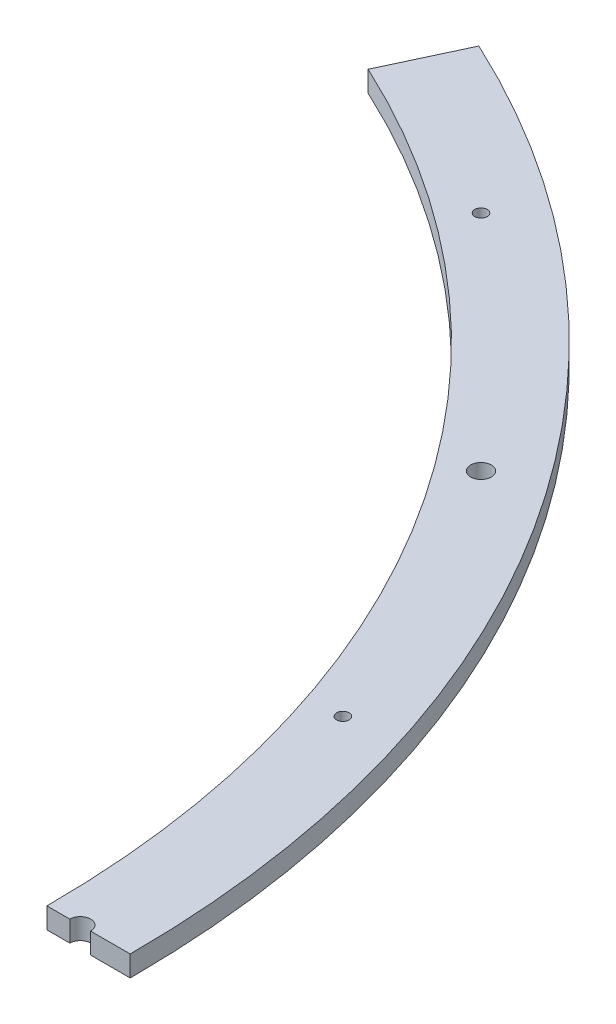
ISO-10303-21;
HEADER;
FILE_DESCRIPTION(('STEP AP214'),'2;1');
FILE_NAME('part.step','',(''),(''),'','','');
FILE_SCHEMA(('AUTOMOTIVE_DESIGN { 1 0 10303 214 1 1 1 1 }'));
ENDSEC;
DATA;
#1=APPLICATION_CONTEXT('core data for automotive mechanical design processes');
#2=APPLICATION_PROTOCOL_DEFINITION('international standard','automotive_design',2000,#1);
#3=PRODUCT_CONTEXT('',#1,'mechanical');
#4=PRODUCT('Part','Part','',(#3));
#5=PRODUCT_RELATED_PRODUCT_CATEGORY('part','',(#4));
#6=PRODUCT_DEFINITION_FORMATION('','',#4);
#7=PRODUCT_DEFINITION_CONTEXT('part definition',#1,'design');
#8=PRODUCT_DEFINITION('design','',#6,#7);
#9=PRODUCT_DEFINITION_SHAPE('','',#8);
#10=(LENGTH_UNIT() NAMED_UNIT(*) SI_UNIT(.MILLI.,.METRE.));
#11=(NAMED_UNIT(*) PLANE_ANGLE_UNIT() SI_UNIT($,.RADIAN.));
#12=(NAMED_UNIT(*) SI_UNIT($,.STERADIAN.) SOLID_ANGLE_UNIT());
#13=UNCERTAINTY_MEASURE_WITH_UNIT(LENGTH_MEASURE(1.E-05),#10,'distance_accuracy_value','');
#14=(GEOMETRIC_REPRESENTATION_CONTEXT(3) GLOBAL_UNCERTAINTY_ASSIGNED_CONTEXT((#13)) GLOBAL_UNIT_ASSIGNED_CONTEXT((#10,
#11,#12)) REPRESENTATION_CONTEXT('',''));
#15=CARTESIAN_POINT('',(0.,0.,0.));
#16=DIRECTION('',(0.,0.,1.));
#17=DIRECTION('',(1.,0.,0.));
#18=AXIS2_PLACEMENT_3D('',#15,#16,#17);
#19=CARTESIAN_POINT('',(0.,5.,0.));
#20=DIRECTION('',(0.,1.,0.));
#21=DIRECTION('',(0.,0.,1.));
#22=AXIS2_PLACEMENT_3D('',#19,#20,#21);
#23=PLANE('',#22);
#24=DIRECTION('',(0.422618261740704,0.,-0.906307787036648));
#25=VECTOR('',#24,1.);
#26=CARTESIAN_POINT('',(0.,5.,0.));
#27=LINE('',#26,#25);
#28=CARTESIAN_POINT('',(99.103982378195,5.,-212.529176060094));
#29=VERTEX_POINT('',#28);
#30=CARTESIAN_POINT('',(107.556347613009,5.,-230.655331800827));
#31=VERTEX_POINT('',#30);
#32=EDGE_CURVE('E83',#29,#31,#27,.T.);
#33=ORIENTED_EDGE('',*,*,#32,.F.);
#34=CARTESIAN_POINT('',(0.,5.,0.));
#35=DIRECTION('',(0.,1.,0.));
#36=DIRECTION('',(0.,0.,1.));
#37=AXIS2_PLACEMENT_3D('',#34,#35,#36);
#38=CIRCLE('',#37,234.5);
#39=CARTESIAN_POINT('',(234.5,5.,0.));
#40=VERTEX_POINT('',#39);
#41=EDGE_CURVE('E105',#40,#29,#38,.T.);
#42=ORIENTED_EDGE('',*,*,#41,.F.);
#43=DIRECTION('',(-1.,0.,0.));
#44=VECTOR('',#43,1.);
#45=CARTESIAN_POINT('',(254.5,5.,0.));
#46=LINE('',#45,#44);
#47=CARTESIAN_POINT('',(240.,5.,0.));
#48=VERTEX_POINT('',#47);
#49=EDGE_CURVE('E145',#48,#40,#46,.T.);
#50=ORIENTED_EDGE('',*,*,#49,.F.);
#51=CARTESIAN_POINT('',(242.5,5.,0.));
#52=DIRECTION('',(0.,1.,0.));
#53=DIRECTION('',(0.,0.,1.));
#54=AXIS2_PLACEMENT_3D('',#51,#52,#53);
#55=CIRCLE('',#54,2.5);
#56=CARTESIAN_POINT('',(245.,5.,0.));
#57=VERTEX_POINT('',#56);
#58=EDGE_CURVE('E117',#57,#48,#55,.T.);
#59=ORIENTED_EDGE('',*,*,#58,.F.);
#60=CARTESIAN_POINT('',(254.5,5.,0.));
#61=VERTEX_POINT('',#60);
#62=EDGE_CURVE('E55',#61,#57,#46,.T.);
#63=ORIENTED_EDGE('',*,*,#62,.F.);
#64=CARTESIAN_POINT('',(0.,5.,0.));
#65=DIRECTION('',(0.,1.,0.));
#66=DIRECTION('',(0.,0.,1.));
#67=AXIS2_PLACEMENT_3D('',#64,#65,#66);
#68=CIRCLE('',#67,254.5);
#69=EDGE_CURVE('E96',#61,#31,#68,.T.);
#70=ORIENTED_EDGE('',*,*,#69,.T.);
#71=EDGE_LOOP('',(#33,#42,#50,#59,#63,#70));
#72=FACE_BOUND('',#71,.T.);
#73=CARTESIAN_POINT('',(230.631205201575,5.,-74.9366211359248));
#74=DIRECTION('',(0.,1.,0.));
#75=DIRECTION('',(0.,0.,1.));
#76=AXIS2_PLACEMENT_3D('',#73,#74,#75);
#77=CIRCLE('',#76,1.5);
#78=CARTESIAN_POINT('',(230.631205201575,5.,-73.4366211359248));
#79=VERTEX_POINT('',#78);
#80=EDGE_CURVE('E157',#79,#79,#77,.T.);
#81=ORIENTED_EDGE('',*,*,#80,.F.);
#82=EDGE_LOOP('',(#81));
#83=FACE_BOUND('',#82,.T.);
#84=CARTESIAN_POINT('',(142.53792368092,5.,-196.186621135921));
#85=DIRECTION('',(0.,1.,0.));
#86=DIRECTION('',(0.,0.,1.));
#87=AXIS2_PLACEMENT_3D('',#84,#85,#86);
#88=CIRCLE('',#87,1.50000000000597);
#89=CARTESIAN_POINT('',(142.53792368092,5.,-194.686621135915));
#90=VERTEX_POINT('',#89);
#91=EDGE_CURVE('E140',#90,#90,#88,.T.);
#92=ORIENTED_EDGE('',*,*,#91,.F.);
#93=EDGE_LOOP('',(#92));
#94=FACE_BOUND('',#93,.T.);
#95=CARTESIAN_POINT('',(196.186621135925,5.,-142.537923680925));
#96=DIRECTION('',(0.,1.,0.));
#97=DIRECTION('',(0.,0.,1.));
#98=AXIS2_PLACEMENT_3D('',#95,#96,#97);
#99=CIRCLE('',#98,2.5);
#100=CARTESIAN_POINT('',(196.186621135925,5.,-140.037923680925));
#101=VERTEX_POINT('',#100);
#102=EDGE_CURVE('E138',#101,#101,#99,.T.);
#103=ORIENTED_EDGE('',*,*,#102,.F.);
#104=EDGE_LOOP('',(#103));
#105=FACE_BOUND('',#104,.T.);
#106=ADVANCED_FACE('F33',(#72,#83,#94,#105),#23,.T.);
#107=CARTESIAN_POINT('',(0.,0.,0.));
#108=DIRECTION('',(0.,1.,0.));
#109=DIRECTION('',(0.,0.,1.));
#110=AXIS2_PLACEMENT_3D('',#107,#108,#109);
#111=PLANE('',#110);
#112=CARTESIAN_POINT('',(230.631205201575,0.,-74.9366211359248));
#113=DIRECTION('',(0.,1.,0.));
#114=DIRECTION('',(0.,0.,1.));
#115=AXIS2_PLACEMENT_3D('',#112,#113,#114);
#116=CIRCLE('',#115,1.5);
#117=CARTESIAN_POINT('',(230.631205201575,0.,-73.4366211359248));
#118=VERTEX_POINT('',#117);
#119=EDGE_CURVE('E133',#118,#118,#116,.T.);
#120=ORIENTED_EDGE('',*,*,#119,.T.);
#121=EDGE_LOOP('',(#120));
#122=FACE_BOUND('',#121,.T.);
#123=CARTESIAN_POINT('',(142.53792368092,0.,-196.186621135921));
#124=DIRECTION('',(0.,1.,0.));
#125=DIRECTION('',(0.,0.,1.));
#126=AXIS2_PLACEMENT_3D('',#123,#124,#125);
#127=CIRCLE('',#126,1.50000000000597);
#128=CARTESIAN_POINT('',(142.53792368092,0.,-194.686621135915));
#129=VERTEX_POINT('',#128);
#130=EDGE_CURVE('E155',#129,#129,#127,.T.);
#131=ORIENTED_EDGE('',*,*,#130,.T.);
#132=EDGE_LOOP('',(#131));
#133=FACE_BOUND('',#132,.T.);
#134=CARTESIAN_POINT('',(0.,0.,0.));
#135=DIRECTION('',(0.,1.,0.));
#136=DIRECTION('',(0.,0.,1.));
#137=AXIS2_PLACEMENT_3D('',#134,#135,#136);
#138=CIRCLE('',#137,234.5);
#139=CARTESIAN_POINT('',(234.5,0.,0.));
#140=VERTEX_POINT('',#139);
#141=CARTESIAN_POINT('',(99.103982378195,0.,-212.529176060094));
#142=VERTEX_POINT('',#141);
#143=EDGE_CURVE('E108',#140,#142,#138,.T.);
#144=ORIENTED_EDGE('',*,*,#143,.T.);
#145=DIRECTION('',(0.422618261740704,0.,-0.906307787036648));
#146=VECTOR('',#145,1.);
#147=CARTESIAN_POINT('',(0.,0.,0.));
#148=LINE('',#147,#146);
#149=CARTESIAN_POINT('',(107.556347613009,0.,-230.655331800827));
#150=VERTEX_POINT('',#149);
#151=EDGE_CURVE('E47',#142,#150,#148,.T.);
#152=ORIENTED_EDGE('',*,*,#151,.T.);
#153=CARTESIAN_POINT('',(0.,0.,0.));
#154=DIRECTION('',(0.,1.,0.));
#155=DIRECTION('',(0.,0.,1.));
#156=AXIS2_PLACEMENT_3D('',#153,#154,#155);
#157=CIRCLE('',#156,254.5);
#158=CARTESIAN_POINT('',(254.5,0.,0.));
#159=VERTEX_POINT('',#158);
#160=EDGE_CURVE('E98',#159,#150,#157,.T.);
#161=ORIENTED_EDGE('',*,*,#160,.F.);
#162=DIRECTION('',(-1.,0.,0.));
#163=VECTOR('',#162,1.);
#164=CARTESIAN_POINT('',(0.,0.,0.));
#165=LINE('',#164,#163);
#166=CARTESIAN_POINT('',(245.,0.,0.));
#167=VERTEX_POINT('',#166);
#168=EDGE_CURVE('E128',#159,#167,#165,.T.);
#169=ORIENTED_EDGE('',*,*,#168,.T.);
#170=CARTESIAN_POINT('',(242.5,0.,0.));
#171=DIRECTION('',(0.,1.,0.));
#172=DIRECTION('',(0.,0.,1.));
#173=AXIS2_PLACEMENT_3D('',#170,#171,#172);
#174=CIRCLE('',#173,2.5);
#175=CARTESIAN_POINT('',(240.,0.,0.));
#176=VERTEX_POINT('',#175);
#177=EDGE_CURVE('E116',#167,#176,#174,.T.);
#178=ORIENTED_EDGE('',*,*,#177,.T.);
#179=EDGE_CURVE('E126',#176,#140,#165,.T.);
#180=ORIENTED_EDGE('',*,*,#179,.T.);
#181=EDGE_LOOP('',(#144,#152,#161,#169,#178,#180));
#182=FACE_BOUND('',#181,.T.);
#183=CARTESIAN_POINT('',(196.186621135925,0.,-142.537923680925));
#184=DIRECTION('',(0.,1.,0.));
#185=DIRECTION('',(0.,0.,1.));
#186=AXIS2_PLACEMENT_3D('',#183,#184,#185);
#187=CIRCLE('',#186,2.5);
#188=CARTESIAN_POINT('',(196.186621135925,0.,-140.037923680925));
#189=VERTEX_POINT('',#188);
#190=EDGE_CURVE('E130',#189,#189,#187,.T.);
#191=ORIENTED_EDGE('',*,*,#190,.T.);
#192=EDGE_LOOP('',(#191));
#193=FACE_BOUND('',#192,.T.);
#194=ADVANCED_FACE('F124',(#122,#133,#182,#193),#111,.F.);
#195=CARTESIAN_POINT('',(0.,5.,0.));
#196=DIRECTION('',(0.,-1.,0.));
#197=DIRECTION('',(0.,0.,-1.));
#198=AXIS2_PLACEMENT_3D('',#195,#196,#197);
#199=CYLINDRICAL_SURFACE('',#198,254.5);
#200=ORIENTED_EDGE('',*,*,#160,.T.);
#201=DIRECTION('',(0.,1.,0.));
#202=VECTOR('',#201,1.);
#203=CARTESIAN_POINT('',(107.556347613009,-5.,-230.655331800827));
#204=LINE('',#203,#202);
#205=EDGE_CURVE('E86',#150,#31,#204,.T.);
#206=ORIENTED_EDGE('',*,*,#205,.T.);
#207=ORIENTED_EDGE('',*,*,#69,.F.);
#208=DIRECTION('',(0.,1.,0.));
#209=VECTOR('',#208,1.);
#210=CARTESIAN_POINT('',(254.5,-5.,0.));
#211=LINE('',#210,#209);
#212=EDGE_CURVE('E147',#159,#61,#211,.T.);
#213=ORIENTED_EDGE('',*,*,#212,.F.);
#214=EDGE_LOOP('',(#200,#206,#207,#213));
#215=FACE_BOUND('',#214,.T.);
#216=ADVANCED_FACE('F35',(#215),#199,.T.);
#217=CARTESIAN_POINT('',(0.,5.,0.));
#218=DIRECTION('',(0.,-1.,0.));
#219=DIRECTION('',(0.,0.,-1.));
#220=AXIS2_PLACEMENT_3D('',#217,#218,#219);
#221=CYLINDRICAL_SURFACE('',#220,234.5);
#222=DIRECTION('',(0.,-1.,0.));
#223=VECTOR('',#222,1.);
#224=CARTESIAN_POINT('',(99.103982378195,5.,-212.529176060094));
#225=LINE('',#224,#223);
#226=EDGE_CURVE('E11',#142,#29,#225,.F.);
#227=ORIENTED_EDGE('',*,*,#226,.F.);
#228=ORIENTED_EDGE('',*,*,#143,.F.);
#229=DIRECTION('',(0.,-1.,0.));
#230=VECTOR('',#229,1.);
#231=CARTESIAN_POINT('',(234.5,5.,0.));
#232=LINE('',#231,#230);
#233=EDGE_CURVE('E144',#40,#140,#232,.T.);
#234=ORIENTED_EDGE('',*,*,#233,.F.);
#235=ORIENTED_EDGE('',*,*,#41,.T.);
#236=EDGE_LOOP('',(#227,#228,#234,#235));
#237=FACE_BOUND('',#236,.T.);
#238=ADVANCED_FACE('F143',(#237),#221,.F.);
#239=CARTESIAN_POINT('',(196.186621135925,0.,-142.537923680925));
#240=DIRECTION('',(0.,1.,0.));
#241=DIRECTION('',(0.,0.,1.));
#242=AXIS2_PLACEMENT_3D('',#239,#240,#241);
#243=CYLINDRICAL_SURFACE('',#242,2.5);
#244=ORIENTED_EDGE('',*,*,#190,.F.);
#245=EDGE_LOOP('',(#244));
#246=FACE_BOUND('',#245,.T.);
#247=ORIENTED_EDGE('',*,*,#102,.T.);
#248=EDGE_LOOP('',(#247));
#249=FACE_BOUND('',#248,.T.);
#250=ADVANCED_FACE('F189',(#246,#249),#243,.F.);
#251=CARTESIAN_POINT('',(242.5,0.,0.));
#252=DIRECTION('',(0.,1.,0.));
#253=DIRECTION('',(0.,0.,1.));
#254=AXIS2_PLACEMENT_3D('',#251,#252,#253);
#255=CYLINDRICAL_SURFACE('',#254,2.5);
#256=ORIENTED_EDGE('',*,*,#58,.T.);
#257=DIRECTION('',(0.,1.,0.));
#258=VECTOR('',#257,1.);
#259=CARTESIAN_POINT('',(240.,0.,0.));
#260=LINE('',#259,#258);
#261=EDGE_CURVE('E41',#48,#176,#260,.F.);
#262=ORIENTED_EDGE('',*,*,#261,.T.);
#263=ORIENTED_EDGE('',*,*,#177,.F.);
#264=DIRECTION('',(0.,1.,0.));
#265=VECTOR('',#264,1.);
#266=CARTESIAN_POINT('',(245.,0.,0.));
#267=LINE('',#266,#265);
#268=EDGE_CURVE('E102',#167,#57,#267,.T.);
#269=ORIENTED_EDGE('',*,*,#268,.T.);
#270=EDGE_LOOP('',(#256,#262,#263,#269));
#271=FACE_BOUND('',#270,.T.);
#272=ADVANCED_FACE('F115',(#271),#255,.F.);
#273=CARTESIAN_POINT('',(142.53792368092,0.,-196.186621135921));
#274=DIRECTION('',(0.,1.,0.));
#275=DIRECTION('',(0.,0.,1.));
#276=AXIS2_PLACEMENT_3D('',#273,#274,#275);
#277=CYLINDRICAL_SURFACE('',#276,1.50000000000597);
#278=ORIENTED_EDGE('',*,*,#130,.F.);
#279=EDGE_LOOP('',(#278));
#280=FACE_BOUND('',#279,.T.);
#281=ORIENTED_EDGE('',*,*,#91,.T.);
#282=EDGE_LOOP('',(#281));
#283=FACE_BOUND('',#282,.T.);
#284=ADVANCED_FACE('F169',(#280,#283),#277,.F.);
#285=CARTESIAN_POINT('',(230.631205201575,0.,-74.9366211359248));
#286=DIRECTION('',(0.,1.,0.));
#287=DIRECTION('',(0.,0.,1.));
#288=AXIS2_PLACEMENT_3D('',#285,#286,#287);
#289=CYLINDRICAL_SURFACE('',#288,1.5);
#290=ORIENTED_EDGE('',*,*,#119,.F.);
#291=EDGE_LOOP('',(#290));
#292=FACE_BOUND('',#291,.T.);
#293=ORIENTED_EDGE('',*,*,#80,.T.);
#294=EDGE_LOOP('',(#293));
#295=FACE_BOUND('',#294,.T.);
#296=ADVANCED_FACE('F166',(#292,#295),#289,.F.);
#297=CARTESIAN_POINT('',(254.5,-5.,0.));
#298=DIRECTION('',(0.,0.,-1.));
#299=DIRECTION('',(-1.,0.,0.));
#300=AXIS2_PLACEMENT_3D('',#297,#298,#299);
#301=PLANE('',#300);
#302=ORIENTED_EDGE('',*,*,#212,.T.);
#303=ORIENTED_EDGE('',*,*,#62,.T.);
#304=ORIENTED_EDGE('',*,*,#268,.F.);
#305=ORIENTED_EDGE('',*,*,#168,.F.);
#306=EDGE_LOOP('',(#302,#303,#304,#305));
#307=FACE_BOUND('',#306,.T.);
#308=ADVANCED_FACE('F168',(#307),#301,.F.);
#309=ORIENTED_EDGE('',*,*,#233,.T.);
#310=ORIENTED_EDGE('',*,*,#179,.F.);
#311=ORIENTED_EDGE('',*,*,#261,.F.);
#312=ORIENTED_EDGE('',*,*,#49,.T.);
#313=EDGE_LOOP('',(#309,#310,#311,#312));
#314=FACE_BOUND('',#313,.T.);
#315=ADVANCED_FACE('F175',(#314),#301,.F.);
#316=CARTESIAN_POINT('',(0.,-5.,0.));
#317=DIRECTION('',(0.906307787036648,0.,0.422618261740704));
#318=DIRECTION('',(0.422618261740704,0.,-0.906307787036648));
#319=AXIS2_PLACEMENT_3D('',#316,#317,#318);
#320=PLANE('',#319);
#321=ORIENTED_EDGE('',*,*,#226,.T.);
#322=ORIENTED_EDGE('',*,*,#32,.T.);
#323=ORIENTED_EDGE('',*,*,#205,.F.);
#324=ORIENTED_EDGE('',*,*,#151,.F.);
#325=EDGE_LOOP('',(#321,#322,#323,#324));
#326=FACE_BOUND('',#325,.T.);
#327=ADVANCED_FACE('F85',(#326),#320,.F.);
#328=CLOSED_SHELL('',(#106,#194,#216,#238,#250,#272,#284,#296,#308,#315,#327));
#329=MANIFOLD_SOLID_BREP('B2',#328);
#330=ADVANCED_BREP_SHAPE_REPRESENTATION('',(#18,#329),#14);
#331=SHAPE_DEFINITION_REPRESENTATION(#9,#330);
ENDSEC;
END-ISO-10303-21;
